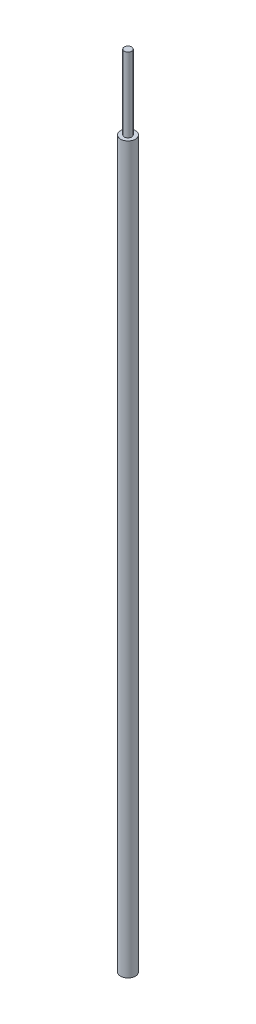
ISO-10303-21;
HEADER;
FILE_DESCRIPTION(('STEP AP214'),'2;1');
FILE_NAME('part.step','',(''),(''),'','','');
FILE_SCHEMA(('AUTOMOTIVE_DESIGN { 1 0 10303 214 1 1 1 1 }'));
ENDSEC;
DATA;
#1=APPLICATION_CONTEXT('core data for automotive mechanical design processes');
#2=APPLICATION_PROTOCOL_DEFINITION('international standard','automotive_design',2000,#1);
#3=PRODUCT_CONTEXT('',#1,'mechanical');
#4=PRODUCT('Part','Part','',(#3));
#5=PRODUCT_RELATED_PRODUCT_CATEGORY('part','',(#4));
#6=PRODUCT_DEFINITION_FORMATION('','',#4);
#7=PRODUCT_DEFINITION_CONTEXT('part definition',#1,'design');
#8=PRODUCT_DEFINITION('design','',#6,#7);
#9=PRODUCT_DEFINITION_SHAPE('','',#8);
#10=(LENGTH_UNIT() NAMED_UNIT(*) SI_UNIT(.MILLI.,.METRE.));
#11=(NAMED_UNIT(*) PLANE_ANGLE_UNIT() SI_UNIT($,.RADIAN.));
#12=(NAMED_UNIT(*) SI_UNIT($,.STERADIAN.) SOLID_ANGLE_UNIT());
#13=UNCERTAINTY_MEASURE_WITH_UNIT(LENGTH_MEASURE(1.E-05),#10,'distance_accuracy_value','');
#14=(GEOMETRIC_REPRESENTATION_CONTEXT(3) GLOBAL_UNCERTAINTY_ASSIGNED_CONTEXT((#13)) GLOBAL_UNIT_ASSIGNED_CONTEXT((#10,
#11,#12)) REPRESENTATION_CONTEXT('',''));
#15=CARTESIAN_POINT('',(0.,0.,0.));
#16=DIRECTION('',(0.,0.,1.));
#17=DIRECTION('',(1.,0.,0.));
#18=AXIS2_PLACEMENT_3D('',#15,#16,#17);
#19=CARTESIAN_POINT('',(0.,19.5,0.));
#20=DIRECTION('',(0.,-1.,0.));
#21=DIRECTION('',(0.,0.,-1.));
#22=AXIS2_PLACEMENT_3D('',#19,#20,#21);
#23=CYLINDRICAL_SURFACE('',#22,0.2);
#24=CARTESIAN_POINT('',(0.,19.5,0.));
#25=DIRECTION('',(0.,1.,0.));
#26=DIRECTION('',(0.,0.,1.));
#27=AXIS2_PLACEMENT_3D('',#24,#25,#26);
#28=CIRCLE('',#27,0.2);
#29=CARTESIAN_POINT('',(0.,19.5,0.2));
#30=VERTEX_POINT('',#29);
#31=EDGE_CURVE('E39',#30,#30,#28,.T.);
#32=ORIENTED_EDGE('',*,*,#31,.F.);
#33=EDGE_LOOP('',(#32));
#34=FACE_BOUND('',#33,.T.);
#35=CARTESIAN_POINT('',(0.,0.,0.));
#36=DIRECTION('',(0.,1.,0.));
#37=DIRECTION('',(0.,0.,1.));
#38=AXIS2_PLACEMENT_3D('',#35,#36,#37);
#39=CIRCLE('',#38,0.2);
#40=CARTESIAN_POINT('',(0.,0.,0.2));
#41=VERTEX_POINT('',#40);
#42=EDGE_CURVE('E35',#41,#41,#39,.T.);
#43=ORIENTED_EDGE('',*,*,#42,.T.);
#44=EDGE_LOOP('',(#43));
#45=FACE_BOUND('',#44,.T.);
#46=ADVANCED_FACE('F32',(#34,#45),#23,.T.);
#47=CARTESIAN_POINT('',(0.,19.5,0.));
#48=DIRECTION('',(0.,1.,0.));
#49=DIRECTION('',(0.,0.,1.));
#50=AXIS2_PLACEMENT_3D('',#47,#48,#49);
#51=PLANE('',#50);
#52=CARTESIAN_POINT('',(0.,19.5,0.));
#53=DIRECTION('',(0.,1.,0.));
#54=DIRECTION('',(0.,0.,1.));
#55=AXIS2_PLACEMENT_3D('',#52,#53,#54);
#56=CIRCLE('',#55,0.1);
#57=CARTESIAN_POINT('',(0.,19.5,0.1));
#58=VERTEX_POINT('',#57);
#59=EDGE_CURVE('E10',#58,#58,#56,.T.);
#60=ORIENTED_EDGE('',*,*,#59,.F.);
#61=EDGE_LOOP('',(#60));
#62=FACE_BOUND('',#61,.T.);
#63=ORIENTED_EDGE('',*,*,#31,.T.);
#64=EDGE_LOOP('',(#63));
#65=FACE_BOUND('',#64,.T.);
#66=ADVANCED_FACE('F56',(#62,#65),#51,.T.);
#67=CARTESIAN_POINT('',(0.,0.,0.));
#68=DIRECTION('',(0.,1.,0.));
#69=DIRECTION('',(0.,0.,1.));
#70=AXIS2_PLACEMENT_3D('',#67,#68,#69);
#71=PLANE('',#70);
#72=ORIENTED_EDGE('',*,*,#42,.F.);
#73=EDGE_LOOP('',(#72));
#74=FACE_BOUND('',#73,.T.);
#75=ADVANCED_FACE('F53',(#74),#71,.F.);
#76=CARTESIAN_POINT('',(0.,21.5,0.));
#77=DIRECTION('',(0.,-1.,0.));
#78=DIRECTION('',(0.,0.,-1.));
#79=AXIS2_PLACEMENT_3D('',#76,#77,#78);
#80=CYLINDRICAL_SURFACE('',#79,0.1);
#81=CARTESIAN_POINT('',(0.,21.5,0.));
#82=DIRECTION('',(0.,1.,0.));
#83=DIRECTION('',(0.,0.,1.));
#84=AXIS2_PLACEMENT_3D('',#81,#82,#83);
#85=CIRCLE('',#84,0.1);
#86=CARTESIAN_POINT('',(0.,21.5,0.1));
#87=VERTEX_POINT('',#86);
#88=EDGE_CURVE('E45',#87,#87,#85,.T.);
#89=ORIENTED_EDGE('',*,*,#88,.F.);
#90=EDGE_LOOP('',(#89));
#91=FACE_BOUND('',#90,.T.);
#92=ORIENTED_EDGE('',*,*,#59,.T.);
#93=EDGE_LOOP('',(#92));
#94=FACE_BOUND('',#93,.T.);
#95=ADVANCED_FACE('F55',(#91,#94),#80,.T.);
#96=CARTESIAN_POINT('',(0.,21.5,0.));
#97=DIRECTION('',(0.,1.,0.));
#98=DIRECTION('',(0.,0.,1.));
#99=AXIS2_PLACEMENT_3D('',#96,#97,#98);
#100=PLANE('',#99);
#101=ORIENTED_EDGE('',*,*,#88,.T.);
#102=EDGE_LOOP('',(#101));
#103=FACE_BOUND('',#102,.T.);
#104=ADVANCED_FACE('F61',(#103),#100,.T.);
#105=CLOSED_SHELL('',(#46,#66,#75,#95,#104));
#106=MANIFOLD_SOLID_BREP('B2',#105);
#107=ADVANCED_BREP_SHAPE_REPRESENTATION('',(#18,#106),#14);
#108=SHAPE_DEFINITION_REPRESENTATION(#9,#107);
ENDSEC;
END-ISO-10303-21;
